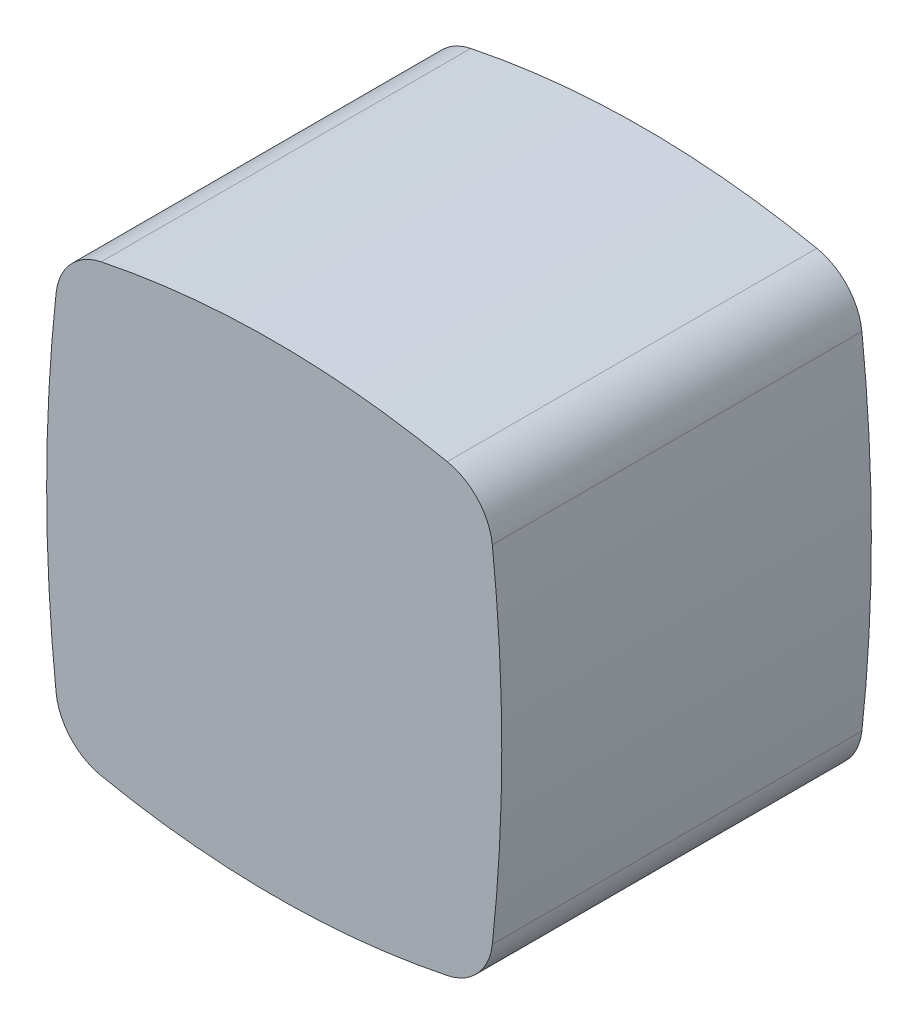
ISO-10303-21;
HEADER;
FILE_DESCRIPTION(('STEP AP214'),'2;1');
FILE_NAME('part.step','',(''),(''),'','','');
FILE_SCHEMA(('AUTOMOTIVE_DESIGN { 1 0 10303 214 1 1 1 1 }'));
ENDSEC;
DATA;
#1=APPLICATION_CONTEXT('core data for automotive mechanical design processes');
#2=APPLICATION_PROTOCOL_DEFINITION('international standard','automotive_design',2000,#1);
#3=PRODUCT_CONTEXT('',#1,'mechanical');
#4=PRODUCT('Part','Part','',(#3));
#5=PRODUCT_RELATED_PRODUCT_CATEGORY('part','',(#4));
#6=PRODUCT_DEFINITION_FORMATION('','',#4);
#7=PRODUCT_DEFINITION_CONTEXT('part definition',#1,'design');
#8=PRODUCT_DEFINITION('design','',#6,#7);
#9=PRODUCT_DEFINITION_SHAPE('','',#8);
#10=(LENGTH_UNIT() NAMED_UNIT(*) SI_UNIT(.MILLI.,.METRE.));
#11=(NAMED_UNIT(*) PLANE_ANGLE_UNIT() SI_UNIT($,.RADIAN.));
#12=(NAMED_UNIT(*) SI_UNIT($,.STERADIAN.) SOLID_ANGLE_UNIT());
#13=UNCERTAINTY_MEASURE_WITH_UNIT(LENGTH_MEASURE(1.E-05),#10,'distance_accuracy_value','');
#14=(GEOMETRIC_REPRESENTATION_CONTEXT(3) GLOBAL_UNCERTAINTY_ASSIGNED_CONTEXT((#13)) GLOBAL_UNIT_ASSIGNED_CONTEXT((#10,
#11,#12)) REPRESENTATION_CONTEXT('',''));
#15=CARTESIAN_POINT('',(0.,0.,0.));
#16=DIRECTION('',(0.,0.,1.));
#17=DIRECTION('',(1.,0.,0.));
#18=AXIS2_PLACEMENT_3D('',#15,#16,#17);
#19=CARTESIAN_POINT('',(37.4,33.5584450836235,11.));
#20=DIRECTION('',(0.,0.,1.));
#21=DIRECTION('',(1.,0.,0.));
#22=AXIS2_PLACEMENT_3D('',#19,#20,#21);
#23=PLANE('',#22);
#24=CARTESIAN_POINT('',(55.7153631784239,28.618723277199,11.));
#25=DIRECTION('',(0.,0.,-1.));
#26=DIRECTION('',(-1.,0.,0.));
#27=AXIS2_PLACEMENT_3D('',#24,#25,#26);
#28=CIRCLE('',#27,2.);
#29=CARTESIAN_POINT('',(55.3102914936283,30.5772729779156,11.));
#30=VERTEX_POINT('',#29);
#31=CARTESIAN_POINT('',(53.7272076543016,28.8360654311915,11.));
#32=VERTEX_POINT('',#31);
#33=EDGE_CURVE('E84',#30,#32,#28,.F.);
#34=ORIENTED_EDGE('',*,*,#33,.F.);
#35=CARTESIAN_POINT('',(61.4,1.13310983275294,11.));
#36=DIRECTION('',(0.,0.,-1.));
#37=DIRECTION('',(-1.,0.,0.));
#38=AXIS2_PLACEMENT_3D('',#35,#36,#37);
#39=CIRCLE('',#38,30.0673127001987);
#40=CARTESIAN_POINT('',(67.4897085063717,30.5772729779156,11.));
#41=VERTEX_POINT('',#40);
#42=EDGE_CURVE('E20',#41,#30,#39,.F.);
#43=ORIENTED_EDGE('',*,*,#42,.F.);
#44=CARTESIAN_POINT('',(67.0846368215762,28.618723277199,11.));
#45=DIRECTION('',(0.,0.,-1.));
#46=DIRECTION('',(-1.,0.,0.));
#47=AXIS2_PLACEMENT_3D('',#44,#45,#46);
#48=CIRCLE('',#47,2.);
#49=CARTESIAN_POINT('',(69.0727923456984,28.8360654311915,11.));
#50=VERTEX_POINT('',#49);
#51=EDGE_CURVE('E82',#50,#41,#48,.F.);
#52=ORIENTED_EDGE('',*,*,#51,.F.);
#53=CARTESIAN_POINT('',(13.4,22.7500000000001,11.));
#54=DIRECTION('',(0.,0.,-1.));
#55=DIRECTION('',(-1.,0.,0.));
#56=AXIS2_PLACEMENT_3D('',#53,#54,#55);
#57=CIRCLE('',#56,56.0044641077834);
#58=CARTESIAN_POINT('',(69.0727923456984,16.6639345688084,11.));
#59=VERTEX_POINT('',#58);
#60=EDGE_CURVE('E102',#59,#50,#57,.F.);
#61=ORIENTED_EDGE('',*,*,#60,.F.);
#62=CARTESIAN_POINT('',(67.0846368215762,16.881276722801,11.));
#63=DIRECTION('',(0.,0.,-1.));
#64=DIRECTION('',(-1.,0.,0.));
#65=AXIS2_PLACEMENT_3D('',#62,#63,#64);
#66=CIRCLE('',#65,2.);
#67=CARTESIAN_POINT('',(67.4897085063717,14.9227270220844,11.));
#68=VERTEX_POINT('',#67);
#69=EDGE_CURVE('E104',#68,#59,#66,.F.);
#70=ORIENTED_EDGE('',*,*,#69,.F.);
#71=CARTESIAN_POINT('',(61.4000000000001,44.3668901672471,11.));
#72=DIRECTION('',(0.,0.,-1.));
#73=DIRECTION('',(-1.,0.,0.));
#74=AXIS2_PLACEMENT_3D('',#71,#72,#73);
#75=CIRCLE('',#74,30.0673127001987);
#76=CARTESIAN_POINT('',(55.3102914936284,14.9227270220845,11.));
#77=VERTEX_POINT('',#76);
#78=EDGE_CURVE('E108',#77,#68,#75,.F.);
#79=ORIENTED_EDGE('',*,*,#78,.F.);
#80=CARTESIAN_POINT('',(55.7153631784239,16.881276722801,11.));
#81=DIRECTION('',(0.,0.,-1.));
#82=DIRECTION('',(-1.,0.,0.));
#83=AXIS2_PLACEMENT_3D('',#80,#81,#82);
#84=CIRCLE('',#83,2.);
#85=CARTESIAN_POINT('',(53.7272076543016,16.6639345688085,11.));
#86=VERTEX_POINT('',#85);
#87=EDGE_CURVE('E111',#86,#77,#84,.F.);
#88=ORIENTED_EDGE('',*,*,#87,.F.);
#89=CARTESIAN_POINT('',(109.4,22.75,11.));
#90=DIRECTION('',(0.,0.,-1.));
#91=DIRECTION('',(-1.,0.,0.));
#92=AXIS2_PLACEMENT_3D('',#89,#90,#91);
#93=CIRCLE('',#92,56.0044641077834);
#94=EDGE_CURVE('E115',#32,#86,#93,.F.);
#95=ORIENTED_EDGE('',*,*,#94,.F.);
#96=EDGE_LOOP('',(#34,#43,#52,#61,#70,#79,#88,#95));
#97=FACE_BOUND('',#96,.T.);
#98=ADVANCED_FACE('F17',(#97),#23,.F.);
#99=CARTESIAN_POINT('',(61.4,1.13310983275294,24.));
#100=DIRECTION('',(0.,0.,-1.));
#101=DIRECTION('',(-1.,0.,0.));
#102=AXIS2_PLACEMENT_3D('',#99,#100,#101);
#103=CYLINDRICAL_SURFACE('',#102,30.0673127001987);
#104=CARTESIAN_POINT('',(61.4,1.13310983275294,24.));
#105=DIRECTION('',(0.,0.,-1.));
#106=DIRECTION('',(-1.,0.,0.));
#107=AXIS2_PLACEMENT_3D('',#104,#105,#106);
#108=CIRCLE('',#107,30.0673127001987);
#109=CARTESIAN_POINT('',(67.4897085063717,30.5772729779156,24.));
#110=VERTEX_POINT('',#109);
#111=CARTESIAN_POINT('',(55.3102914936283,30.5772729779155,24.));
#112=VERTEX_POINT('',#111);
#113=EDGE_CURVE('E92',#110,#112,#108,.F.);
#114=ORIENTED_EDGE('',*,*,#113,.F.);
#115=DIRECTION('',(0.,0.,-1.));
#116=VECTOR('',#115,1.);
#117=CARTESIAN_POINT('',(67.4897085063717,30.5772729779156,24.));
#118=LINE('',#117,#116);
#119=EDGE_CURVE('E89',#41,#110,#118,.F.);
#120=ORIENTED_EDGE('',*,*,#119,.F.);
#121=ORIENTED_EDGE('',*,*,#42,.T.);
#122=DIRECTION('',(0.,0.,-1.));
#123=VECTOR('',#122,1.);
#124=CARTESIAN_POINT('',(55.3102914936283,30.5772729779155,24.));
#125=LINE('',#124,#123);
#126=EDGE_CURVE('E87',#112,#30,#125,.T.);
#127=ORIENTED_EDGE('',*,*,#126,.F.);
#128=EDGE_LOOP('',(#114,#120,#121,#127));
#129=FACE_BOUND('',#128,.T.);
#130=ADVANCED_FACE('F90',(#129),#103,.T.);
#131=CARTESIAN_POINT('',(55.7153631784239,28.618723277199,24.));
#132=DIRECTION('',(0.,0.,-1.));
#133=DIRECTION('',(-1.,0.,0.));
#134=AXIS2_PLACEMENT_3D('',#131,#132,#133);
#135=CYLINDRICAL_SURFACE('',#134,2.);
#136=ORIENTED_EDGE('',*,*,#33,.T.);
#137=DIRECTION('',(0.,0.,-1.));
#138=VECTOR('',#137,1.);
#139=CARTESIAN_POINT('',(53.7272076543016,28.8360654311915,24.));
#140=LINE('',#139,#138);
#141=CARTESIAN_POINT('',(53.7272076543016,28.8360654311915,24.));
#142=VERTEX_POINT('',#141);
#143=EDGE_CURVE('E116',#142,#32,#140,.T.);
#144=ORIENTED_EDGE('',*,*,#143,.F.);
#145=CARTESIAN_POINT('',(55.7153631784239,28.618723277199,24.));
#146=DIRECTION('',(0.,0.,-1.));
#147=DIRECTION('',(-1.,0.,0.));
#148=AXIS2_PLACEMENT_3D('',#145,#146,#147);
#149=CIRCLE('',#148,2.);
#150=EDGE_CURVE('E137',#112,#142,#149,.F.);
#151=ORIENTED_EDGE('',*,*,#150,.F.);
#152=ORIENTED_EDGE('',*,*,#126,.T.);
#153=EDGE_LOOP('',(#136,#144,#151,#152));
#154=FACE_BOUND('',#153,.T.);
#155=ADVANCED_FACE('F216',(#154),#135,.T.);
#156=CARTESIAN_POINT('',(109.4,22.75,24.));
#157=DIRECTION('',(0.,0.,-1.));
#158=DIRECTION('',(-1.,0.,0.));
#159=AXIS2_PLACEMENT_3D('',#156,#157,#158);
#160=CYLINDRICAL_SURFACE('',#159,56.0044641077834);
#161=ORIENTED_EDGE('',*,*,#94,.T.);
#162=DIRECTION('',(0.,0.,-1.));
#163=VECTOR('',#162,1.);
#164=CARTESIAN_POINT('',(53.7272076543016,16.6639345688085,24.));
#165=LINE('',#164,#163);
#166=CARTESIAN_POINT('',(53.7272076543016,16.6639345688085,24.));
#167=VERTEX_POINT('',#166);
#168=EDGE_CURVE('E114',#167,#86,#165,.T.);
#169=ORIENTED_EDGE('',*,*,#168,.F.);
#170=CARTESIAN_POINT('',(109.4,22.75,24.));
#171=DIRECTION('',(0.,0.,-1.));
#172=DIRECTION('',(-1.,0.,0.));
#173=AXIS2_PLACEMENT_3D('',#170,#171,#172);
#174=CIRCLE('',#173,56.0044641077834);
#175=EDGE_CURVE('E135',#142,#167,#174,.F.);
#176=ORIENTED_EDGE('',*,*,#175,.F.);
#177=ORIENTED_EDGE('',*,*,#143,.T.);
#178=EDGE_LOOP('',(#161,#169,#176,#177));
#179=FACE_BOUND('',#178,.T.);
#180=ADVANCED_FACE('F157',(#179),#160,.T.);
#181=CARTESIAN_POINT('',(55.7153631784239,16.881276722801,24.));
#182=DIRECTION('',(0.,0.,-1.));
#183=DIRECTION('',(-1.,0.,0.));
#184=AXIS2_PLACEMENT_3D('',#181,#182,#183);
#185=CYLINDRICAL_SURFACE('',#184,2.);
#186=ORIENTED_EDGE('',*,*,#87,.T.);
#187=DIRECTION('',(0.,0.,-1.));
#188=VECTOR('',#187,1.);
#189=CARTESIAN_POINT('',(55.3102914936283,14.9227270220845,24.));
#190=LINE('',#189,#188);
#191=CARTESIAN_POINT('',(55.3102914936284,14.9227270220845,24.));
#192=VERTEX_POINT('',#191);
#193=EDGE_CURVE('E110',#192,#77,#190,.T.);
#194=ORIENTED_EDGE('',*,*,#193,.F.);
#195=CARTESIAN_POINT('',(55.7153631784239,16.881276722801,24.));
#196=DIRECTION('',(0.,0.,-1.));
#197=DIRECTION('',(-1.,0.,0.));
#198=AXIS2_PLACEMENT_3D('',#195,#196,#197);
#199=CIRCLE('',#198,2.);
#200=EDGE_CURVE('E132',#167,#192,#199,.F.);
#201=ORIENTED_EDGE('',*,*,#200,.F.);
#202=ORIENTED_EDGE('',*,*,#168,.T.);
#203=EDGE_LOOP('',(#186,#194,#201,#202));
#204=FACE_BOUND('',#203,.T.);
#205=ADVANCED_FACE('F153',(#204),#185,.T.);
#206=CARTESIAN_POINT('',(61.4000000000001,44.3668901672471,24.));
#207=DIRECTION('',(0.,0.,-1.));
#208=DIRECTION('',(-1.,0.,0.));
#209=AXIS2_PLACEMENT_3D('',#206,#207,#208);
#210=CYLINDRICAL_SURFACE('',#209,30.0673127001987);
#211=CARTESIAN_POINT('',(61.4000000000001,44.3668901672471,24.));
#212=DIRECTION('',(0.,0.,-1.));
#213=DIRECTION('',(-1.,0.,0.));
#214=AXIS2_PLACEMENT_3D('',#211,#212,#213);
#215=CIRCLE('',#214,30.0673127001987);
#216=CARTESIAN_POINT('',(67.4897085063717,14.9227270220844,24.));
#217=VERTEX_POINT('',#216);
#218=EDGE_CURVE('E129',#192,#217,#215,.F.);
#219=ORIENTED_EDGE('',*,*,#218,.F.);
#220=ORIENTED_EDGE('',*,*,#193,.T.);
#221=ORIENTED_EDGE('',*,*,#78,.T.);
#222=DIRECTION('',(0.,0.,-1.));
#223=VECTOR('',#222,1.);
#224=CARTESIAN_POINT('',(67.4897085063717,14.9227270220844,24.));
#225=LINE('',#224,#223);
#226=EDGE_CURVE('E107',#217,#68,#225,.T.);
#227=ORIENTED_EDGE('',*,*,#226,.F.);
#228=EDGE_LOOP('',(#219,#220,#221,#227));
#229=FACE_BOUND('',#228,.T.);
#230=ADVANCED_FACE('F161',(#229),#210,.T.);
#231=CARTESIAN_POINT('',(67.0846368215762,16.881276722801,24.));
#232=DIRECTION('',(0.,0.,-1.));
#233=DIRECTION('',(-1.,0.,0.));
#234=AXIS2_PLACEMENT_3D('',#231,#232,#233);
#235=CYLINDRICAL_SURFACE('',#234,2.);
#236=ORIENTED_EDGE('',*,*,#69,.T.);
#237=DIRECTION('',(0.,0.,-1.));
#238=VECTOR('',#237,1.);
#239=CARTESIAN_POINT('',(69.0727923456984,16.6639345688084,24.));
#240=LINE('',#239,#238);
#241=CARTESIAN_POINT('',(69.0727923456984,16.6639345688084,24.));
#242=VERTEX_POINT('',#241);
#243=EDGE_CURVE('E97',#242,#59,#240,.T.);
#244=ORIENTED_EDGE('',*,*,#243,.F.);
#245=CARTESIAN_POINT('',(67.0846368215762,16.881276722801,24.));
#246=DIRECTION('',(0.,0.,-1.));
#247=DIRECTION('',(-1.,0.,0.));
#248=AXIS2_PLACEMENT_3D('',#245,#246,#247);
#249=CIRCLE('',#248,2.);
#250=EDGE_CURVE('E126',#217,#242,#249,.F.);
#251=ORIENTED_EDGE('',*,*,#250,.F.);
#252=ORIENTED_EDGE('',*,*,#226,.T.);
#253=EDGE_LOOP('',(#236,#244,#251,#252));
#254=FACE_BOUND('',#253,.T.);
#255=ADVANCED_FACE('F162',(#254),#235,.T.);
#256=CARTESIAN_POINT('',(13.4,22.7500000000001,24.));
#257=DIRECTION('',(0.,0.,-1.));
#258=DIRECTION('',(-1.,0.,0.));
#259=AXIS2_PLACEMENT_3D('',#256,#257,#258);
#260=CYLINDRICAL_SURFACE('',#259,56.0044641077834);
#261=CARTESIAN_POINT('',(13.4,22.7500000000001,24.));
#262=DIRECTION('',(0.,0.,-1.));
#263=DIRECTION('',(-1.,0.,0.));
#264=AXIS2_PLACEMENT_3D('',#261,#262,#263);
#265=CIRCLE('',#264,56.0044641077834);
#266=CARTESIAN_POINT('',(69.0727923456985,28.8360654311915,24.));
#267=VERTEX_POINT('',#266);
#268=EDGE_CURVE('E26',#242,#267,#265,.F.);
#269=ORIENTED_EDGE('',*,*,#268,.F.);
#270=ORIENTED_EDGE('',*,*,#243,.T.);
#271=ORIENTED_EDGE('',*,*,#60,.T.);
#272=DIRECTION('',(0.,0.,-1.));
#273=VECTOR('',#272,1.);
#274=CARTESIAN_POINT('',(69.0727923456985,28.8360654311915,24.));
#275=LINE('',#274,#273);
#276=EDGE_CURVE('E35',#267,#50,#275,.T.);
#277=ORIENTED_EDGE('',*,*,#276,.F.);
#278=EDGE_LOOP('',(#269,#270,#271,#277));
#279=FACE_BOUND('',#278,.T.);
#280=ADVANCED_FACE('F143',(#279),#260,.T.);
#281=CARTESIAN_POINT('',(67.0846368215762,28.618723277199,24.));
#282=DIRECTION('',(0.,0.,-1.));
#283=DIRECTION('',(-1.,0.,0.));
#284=AXIS2_PLACEMENT_3D('',#281,#282,#283);
#285=CYLINDRICAL_SURFACE('',#284,2.);
#286=ORIENTED_EDGE('',*,*,#51,.T.);
#287=ORIENTED_EDGE('',*,*,#119,.T.);
#288=CARTESIAN_POINT('',(67.0846368215762,28.618723277199,24.));
#289=DIRECTION('',(0.,0.,-1.));
#290=DIRECTION('',(-1.,0.,0.));
#291=AXIS2_PLACEMENT_3D('',#288,#289,#290);
#292=CIRCLE('',#291,2.);
#293=EDGE_CURVE('E11',#267,#110,#292,.F.);
#294=ORIENTED_EDGE('',*,*,#293,.F.);
#295=ORIENTED_EDGE('',*,*,#276,.T.);
#296=EDGE_LOOP('',(#286,#287,#294,#295));
#297=FACE_BOUND('',#296,.T.);
#298=ADVANCED_FACE('F95',(#297),#285,.T.);
#299=CARTESIAN_POINT('',(37.4,33.5584450836235,24.));
#300=DIRECTION('',(0.,0.,1.));
#301=DIRECTION('',(1.,0.,0.));
#302=AXIS2_PLACEMENT_3D('',#299,#300,#301);
#303=PLANE('',#302);
#304=ORIENTED_EDGE('',*,*,#268,.T.);
#305=ORIENTED_EDGE('',*,*,#293,.T.);
#306=ORIENTED_EDGE('',*,*,#113,.T.);
#307=ORIENTED_EDGE('',*,*,#150,.T.);
#308=ORIENTED_EDGE('',*,*,#175,.T.);
#309=ORIENTED_EDGE('',*,*,#200,.T.);
#310=ORIENTED_EDGE('',*,*,#218,.T.);
#311=ORIENTED_EDGE('',*,*,#250,.T.);
#312=EDGE_LOOP('',(#304,#305,#306,#307,#308,#309,#310,#311));
#313=FACE_BOUND('',#312,.T.);
#314=ADVANCED_FACE('F140',(#313),#303,.T.);
#315=CLOSED_SHELL('',(#98,#130,#155,#180,#205,#230,#255,#280,#298,#314));
#316=MANIFOLD_SOLID_BREP('B1',#315);
#317=ADVANCED_BREP_SHAPE_REPRESENTATION('',(#18,#316),#14);
#318=SHAPE_DEFINITION_REPRESENTATION(#9,#317);
ENDSEC;
END-ISO-10303-21;
